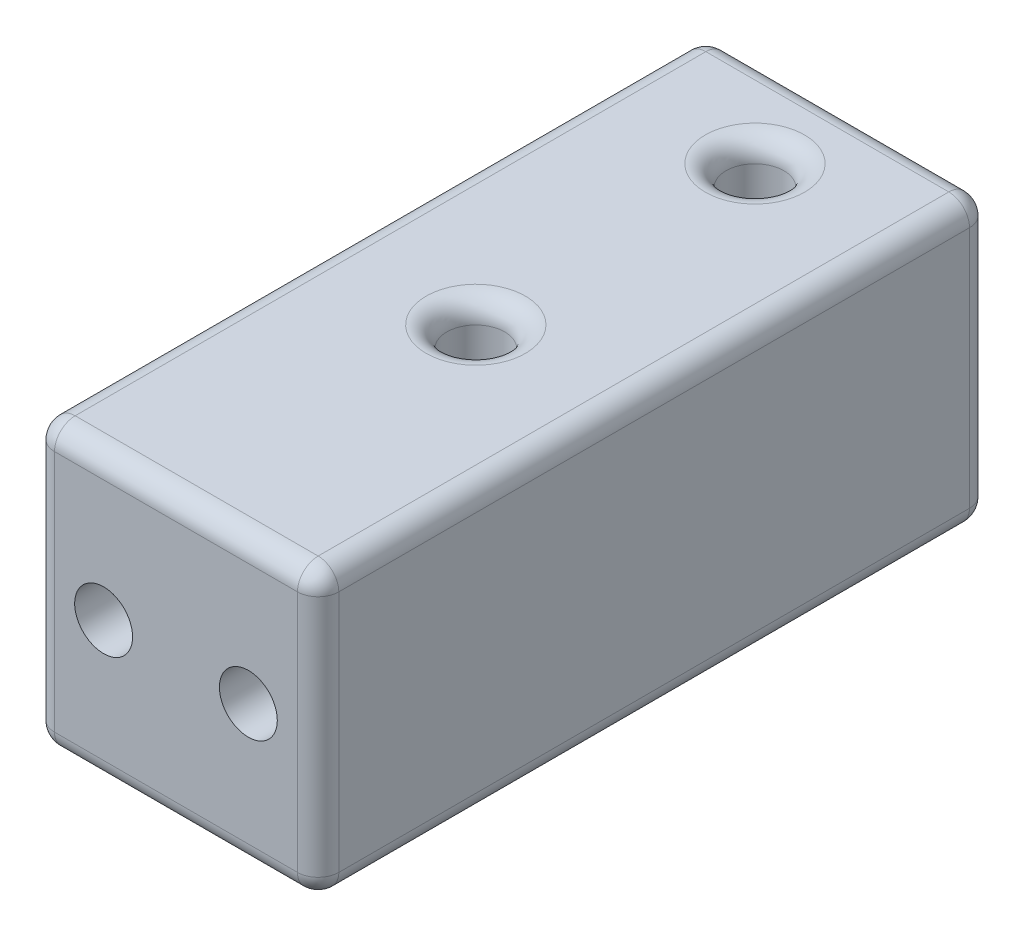
ISO-10303-21;
HEADER;
FILE_DESCRIPTION(('STEP AP214'),'2;1');
FILE_NAME('part.step','',(''),(''),'','','');
FILE_SCHEMA(('AUTOMOTIVE_DESIGN { 1 0 10303 214 1 1 1 1 }'));
ENDSEC;
DATA;
#1=APPLICATION_CONTEXT('core data for automotive mechanical design processes');
#2=APPLICATION_PROTOCOL_DEFINITION('international standard','automotive_design',2000,#1);
#3=PRODUCT_CONTEXT('',#1,'mechanical');
#4=PRODUCT('Part','Part','',(#3));
#5=PRODUCT_RELATED_PRODUCT_CATEGORY('part','',(#4));
#6=PRODUCT_DEFINITION_FORMATION('','',#4);
#7=PRODUCT_DEFINITION_CONTEXT('part definition',#1,'design');
#8=PRODUCT_DEFINITION('design','',#6,#7);
#9=PRODUCT_DEFINITION_SHAPE('','',#8);
#10=(LENGTH_UNIT() NAMED_UNIT(*) SI_UNIT(.MILLI.,.METRE.));
#11=(NAMED_UNIT(*) PLANE_ANGLE_UNIT() SI_UNIT($,.RADIAN.));
#12=(NAMED_UNIT(*) SI_UNIT($,.STERADIAN.) SOLID_ANGLE_UNIT());
#13=UNCERTAINTY_MEASURE_WITH_UNIT(LENGTH_MEASURE(1.E-05),#10,'distance_accuracy_value','');
#14=(GEOMETRIC_REPRESENTATION_CONTEXT(3) GLOBAL_UNCERTAINTY_ASSIGNED_CONTEXT((#13)) GLOBAL_UNIT_ASSIGNED_CONTEXT((#10,
#11,#12)) REPRESENTATION_CONTEXT('',''));
#15=CARTESIAN_POINT('',(0.,0.,0.));
#16=DIRECTION('',(0.,0.,1.));
#17=DIRECTION('',(1.,0.,0.));
#18=AXIS2_PLACEMENT_3D('',#15,#16,#17);
#19=CARTESIAN_POINT('',(6.875,-6.875,-18.));
#20=DIRECTION('',(1.,0.,0.));
#21=DIRECTION('',(0.,0.,-1.));
#22=AXIS2_PLACEMENT_3D('',#19,#20,#21);
#23=PLANE('',#22);
#24=DIRECTION('',(0.,1.,0.));
#25=VECTOR('',#24,1.);
#26=CARTESIAN_POINT('',(6.875,-6.875,13.5));
#27=LINE('',#26,#25);
#28=CARTESIAN_POINT('',(6.875,5.875,13.5));
#29=VERTEX_POINT('',#28);
#30=CARTESIAN_POINT('',(6.875,-5.875,13.5));
#31=VERTEX_POINT('',#30);
#32=EDGE_CURVE('E199',#29,#31,#27,.F.);
#33=ORIENTED_EDGE('',*,*,#32,.T.);
#34=DIRECTION('',(0.,0.,1.));
#35=VECTOR('',#34,1.);
#36=CARTESIAN_POINT('',(6.875,-5.875,-18.));
#37=LINE('',#36,#35);
#38=CARTESIAN_POINT('',(6.875,-5.875,-17.));
#39=VERTEX_POINT('',#38);
#40=EDGE_CURVE('E204',#31,#39,#37,.F.);
#41=ORIENTED_EDGE('',*,*,#40,.T.);
#42=DIRECTION('',(0.,1.,0.));
#43=VECTOR('',#42,1.);
#44=CARTESIAN_POINT('',(6.875,-6.875,-17.));
#45=LINE('',#44,#43);
#46=CARTESIAN_POINT('',(6.875,5.875,-17.));
#47=VERTEX_POINT('',#46);
#48=EDGE_CURVE('E201',#39,#47,#45,.T.);
#49=ORIENTED_EDGE('',*,*,#48,.T.);
#50=DIRECTION('',(0.,0.,1.));
#51=VECTOR('',#50,1.);
#52=CARTESIAN_POINT('',(6.875,5.875,-18.));
#53=LINE('',#52,#51);
#54=EDGE_CURVE('E197',#47,#29,#53,.T.);
#55=ORIENTED_EDGE('',*,*,#54,.T.);
#56=EDGE_LOOP('',(#33,#41,#49,#55));
#57=FACE_BOUND('',#56,.T.);
#58=ADVANCED_FACE('F37',(#57),#23,.T.);
#59=CARTESIAN_POINT('',(-6.875,-6.875,-18.));
#60=DIRECTION('',(0.,-1.,0.));
#61=DIRECTION('',(0.,0.,-1.));
#62=AXIS2_PLACEMENT_3D('',#59,#60,#61);
#63=PLANE('',#62);
#64=CARTESIAN_POINT('',(1.18717353649296E-13,-6.875,-13.5));
#65=DIRECTION('',(0.,-1.,0.));
#66=DIRECTION('',(0.,0.,-1.));
#67=AXIS2_PLACEMENT_3D('',#64,#65,#66);
#68=CIRCLE('',#67,2.4);
#69=CARTESIAN_POINT('',(1.18717353649296E-13,-6.875,-15.9));
#70=VERTEX_POINT('',#69);
#71=EDGE_CURVE('E278',#70,#70,#68,.F.);
#72=ORIENTED_EDGE('',*,*,#71,.T.);
#73=EDGE_LOOP('',(#72));
#74=FACE_BOUND('',#73,.T.);
#75=CARTESIAN_POINT('',(0.,-6.875,0.));
#76=DIRECTION('',(0.,-1.,0.));
#77=DIRECTION('',(0.,0.,-1.));
#78=AXIS2_PLACEMENT_3D('',#75,#76,#77);
#79=CIRCLE('',#78,2.4);
#80=CARTESIAN_POINT('',(0.,-6.875,-2.4));
#81=VERTEX_POINT('',#80);
#82=EDGE_CURVE('E275',#81,#81,#79,.F.);
#83=ORIENTED_EDGE('',*,*,#82,.T.);
#84=EDGE_LOOP('',(#83));
#85=FACE_BOUND('',#84,.T.);
#86=DIRECTION('',(1.,0.,0.));
#87=VECTOR('',#86,1.);
#88=CARTESIAN_POINT('',(-6.875,-6.875,13.5));
#89=LINE('',#88,#87);
#90=CARTESIAN_POINT('',(5.875,-6.875,13.5));
#91=VERTEX_POINT('',#90);
#92=CARTESIAN_POINT('',(-5.875,-6.875,13.5));
#93=VERTEX_POINT('',#92);
#94=EDGE_CURVE('E190',#91,#93,#89,.F.);
#95=ORIENTED_EDGE('',*,*,#94,.T.);
#96=DIRECTION('',(0.,0.,1.));
#97=VECTOR('',#96,1.);
#98=CARTESIAN_POINT('',(-5.875,-6.875,-18.));
#99=LINE('',#98,#97);
#100=CARTESIAN_POINT('',(-5.875,-6.875,-17.));
#101=VERTEX_POINT('',#100);
#102=EDGE_CURVE('E195',#93,#101,#99,.F.);
#103=ORIENTED_EDGE('',*,*,#102,.T.);
#104=DIRECTION('',(1.,0.,0.));
#105=VECTOR('',#104,1.);
#106=CARTESIAN_POINT('',(-6.875,-6.875,-17.));
#107=LINE('',#106,#105);
#108=CARTESIAN_POINT('',(5.875,-6.875,-17.));
#109=VERTEX_POINT('',#108);
#110=EDGE_CURVE('E192',#101,#109,#107,.T.);
#111=ORIENTED_EDGE('',*,*,#110,.T.);
#112=DIRECTION('',(0.,0.,1.));
#113=VECTOR('',#112,1.);
#114=CARTESIAN_POINT('',(5.875,-6.875,-18.));
#115=LINE('',#114,#113);
#116=EDGE_CURVE('E188',#109,#91,#115,.T.);
#117=ORIENTED_EDGE('',*,*,#116,.T.);
#118=EDGE_LOOP('',(#95,#103,#111,#117));
#119=FACE_BOUND('',#118,.T.);
#120=ADVANCED_FACE('F300',(#74,#85,#119),#63,.T.);
#121=CARTESIAN_POINT('',(-6.875,-6.875,-18.));
#122=DIRECTION('',(-1.,0.,0.));
#123=DIRECTION('',(0.,0.,1.));
#124=AXIS2_PLACEMENT_3D('',#121,#122,#123);
#125=PLANE('',#124);
#126=DIRECTION('',(0.,-1.,0.));
#127=VECTOR('',#126,1.);
#128=CARTESIAN_POINT('',(-6.875,-6.875,-17.));
#129=LINE('',#128,#127);
#130=CARTESIAN_POINT('',(-6.875,5.875,-17.));
#131=VERTEX_POINT('',#130);
#132=CARTESIAN_POINT('',(-6.875,-5.875,-17.));
#133=VERTEX_POINT('',#132);
#134=EDGE_CURVE('E183',#131,#133,#129,.T.);
#135=ORIENTED_EDGE('',*,*,#134,.T.);
#136=DIRECTION('',(0.,0.,1.));
#137=VECTOR('',#136,1.);
#138=CARTESIAN_POINT('',(-6.875,-5.875,-18.));
#139=LINE('',#138,#137);
#140=CARTESIAN_POINT('',(-6.875,-5.875,13.5));
#141=VERTEX_POINT('',#140);
#142=EDGE_CURVE('E186',#133,#141,#139,.T.);
#143=ORIENTED_EDGE('',*,*,#142,.T.);
#144=DIRECTION('',(0.,-1.,0.));
#145=VECTOR('',#144,1.);
#146=CARTESIAN_POINT('',(-6.875,6.875,13.5));
#147=LINE('',#146,#145);
#148=CARTESIAN_POINT('',(-6.875,5.875,13.5));
#149=VERTEX_POINT('',#148);
#150=EDGE_CURVE('E181',#141,#149,#147,.F.);
#151=ORIENTED_EDGE('',*,*,#150,.T.);
#152=DIRECTION('',(0.,0.,1.));
#153=VECTOR('',#152,1.);
#154=CARTESIAN_POINT('',(-6.875,5.875,-18.));
#155=LINE('',#154,#153);
#156=EDGE_CURVE('E179',#149,#131,#155,.F.);
#157=ORIENTED_EDGE('',*,*,#156,.T.);
#158=EDGE_LOOP('',(#135,#143,#151,#157));
#159=FACE_BOUND('',#158,.T.);
#160=ADVANCED_FACE('F306',(#159),#125,.T.);
#161=CARTESIAN_POINT('',(-6.875,6.875,-18.));
#162=DIRECTION('',(0.,1.,0.));
#163=DIRECTION('',(0.,0.,1.));
#164=AXIS2_PLACEMENT_3D('',#161,#162,#163);
#165=PLANE('',#164);
#166=CARTESIAN_POINT('',(1.18717353649296E-13,6.875,-13.5));
#167=DIRECTION('',(0.,1.,0.));
#168=DIRECTION('',(0.,0.,1.));
#169=AXIS2_PLACEMENT_3D('',#166,#167,#168);
#170=CIRCLE('',#169,2.4);
#171=CARTESIAN_POINT('',(1.18717353649296E-13,6.875,-11.1));
#172=VERTEX_POINT('',#171);
#173=EDGE_CURVE('E272',#172,#172,#170,.F.);
#174=ORIENTED_EDGE('',*,*,#173,.T.);
#175=EDGE_LOOP('',(#174));
#176=FACE_BOUND('',#175,.T.);
#177=CARTESIAN_POINT('',(0.,6.875,0.));
#178=DIRECTION('',(0.,1.,0.));
#179=DIRECTION('',(0.,0.,1.));
#180=AXIS2_PLACEMENT_3D('',#177,#178,#179);
#181=CIRCLE('',#180,2.4);
#182=CARTESIAN_POINT('',(0.,6.875,2.4));
#183=VERTEX_POINT('',#182);
#184=EDGE_CURVE('E269',#183,#183,#181,.F.);
#185=ORIENTED_EDGE('',*,*,#184,.T.);
#186=EDGE_LOOP('',(#185));
#187=FACE_BOUND('',#186,.T.);
#188=DIRECTION('',(-1.,0.,0.));
#189=VECTOR('',#188,1.);
#190=CARTESIAN_POINT('',(-6.875,6.875,-17.));
#191=LINE('',#190,#189);
#192=CARTESIAN_POINT('',(5.875,6.875,-17.));
#193=VERTEX_POINT('',#192);
#194=CARTESIAN_POINT('',(-5.875,6.875,-17.));
#195=VERTEX_POINT('',#194);
#196=EDGE_CURVE('E136',#193,#195,#191,.T.);
#197=ORIENTED_EDGE('',*,*,#196,.T.);
#198=DIRECTION('',(0.,0.,1.));
#199=VECTOR('',#198,1.);
#200=CARTESIAN_POINT('',(-5.875,6.875,-18.));
#201=LINE('',#200,#199);
#202=CARTESIAN_POINT('',(-5.875,6.875,13.5));
#203=VERTEX_POINT('',#202);
#204=EDGE_CURVE('E132',#195,#203,#201,.T.);
#205=ORIENTED_EDGE('',*,*,#204,.T.);
#206=DIRECTION('',(-1.,0.,0.));
#207=VECTOR('',#206,1.);
#208=CARTESIAN_POINT('',(6.875,6.875,13.5));
#209=LINE('',#208,#207);
#210=CARTESIAN_POINT('',(5.875,6.875,13.5));
#211=VERTEX_POINT('',#210);
#212=EDGE_CURVE('E124',#203,#211,#209,.F.);
#213=ORIENTED_EDGE('',*,*,#212,.T.);
#214=DIRECTION('',(0.,0.,1.));
#215=VECTOR('',#214,1.);
#216=CARTESIAN_POINT('',(5.875,6.875,-18.));
#217=LINE('',#216,#215);
#218=EDGE_CURVE('E129',#211,#193,#217,.F.);
#219=ORIENTED_EDGE('',*,*,#218,.T.);
#220=EDGE_LOOP('',(#197,#205,#213,#219));
#221=FACE_BOUND('',#220,.T.);
#222=ADVANCED_FACE('F127',(#176,#187,#221),#165,.T.);
#223=CARTESIAN_POINT('',(0.,0.,-18.));
#224=DIRECTION('',(0.,0.,-1.));
#225=DIRECTION('',(-1.,0.,0.));
#226=AXIS2_PLACEMENT_3D('',#223,#224,#225);
#227=PLANE('',#226);
#228=CARTESIAN_POINT('',(-3.5,0.,-18.));
#229=DIRECTION('',(0.,0.,1.));
#230=DIRECTION('',(1.,0.,0.));
#231=AXIS2_PLACEMENT_3D('',#228,#229,#230);
#232=CIRCLE('',#231,1.4);
#233=CARTESIAN_POINT('',(-2.1,0.,-18.));
#234=VERTEX_POINT('',#233);
#235=EDGE_CURVE('E216',#234,#234,#232,.T.);
#236=ORIENTED_EDGE('',*,*,#235,.T.);
#237=EDGE_LOOP('',(#236));
#238=FACE_BOUND('',#237,.T.);
#239=CARTESIAN_POINT('',(3.5,0.,-18.));
#240=DIRECTION('',(0.,0.,1.));
#241=DIRECTION('',(1.,0.,0.));
#242=AXIS2_PLACEMENT_3D('',#239,#240,#241);
#243=CIRCLE('',#242,1.4);
#244=CARTESIAN_POINT('',(4.9,0.,-18.));
#245=VERTEX_POINT('',#244);
#246=EDGE_CURVE('E165',#245,#245,#243,.T.);
#247=ORIENTED_EDGE('',*,*,#246,.T.);
#248=EDGE_LOOP('',(#247));
#249=FACE_BOUND('',#248,.T.);
#250=DIRECTION('',(0.,-1.,0.));
#251=VECTOR('',#250,1.);
#252=CARTESIAN_POINT('',(-5.875,0.,-18.));
#253=LINE('',#252,#251);
#254=CARTESIAN_POINT('',(-5.875,-5.875,-18.));
#255=VERTEX_POINT('',#254);
#256=CARTESIAN_POINT('',(-5.875,5.875,-18.));
#257=VERTEX_POINT('',#256);
#258=EDGE_CURVE('E174',#255,#257,#253,.F.);
#259=ORIENTED_EDGE('',*,*,#258,.T.);
#260=DIRECTION('',(-1.,0.,0.));
#261=VECTOR('',#260,1.);
#262=CARTESIAN_POINT('',(0.,5.875,-18.));
#263=LINE('',#262,#261);
#264=CARTESIAN_POINT('',(5.875,5.875,-18.));
#265=VERTEX_POINT('',#264);
#266=EDGE_CURVE('E176',#257,#265,#263,.F.);
#267=ORIENTED_EDGE('',*,*,#266,.T.);
#268=DIRECTION('',(0.,1.,0.));
#269=VECTOR('',#268,1.);
#270=CARTESIAN_POINT('',(5.875,0.,-18.));
#271=LINE('',#270,#269);
#272=CARTESIAN_POINT('',(5.875,-5.875,-18.));
#273=VERTEX_POINT('',#272);
#274=EDGE_CURVE('E170',#265,#273,#271,.F.);
#275=ORIENTED_EDGE('',*,*,#274,.T.);
#276=DIRECTION('',(1.,0.,0.));
#277=VECTOR('',#276,1.);
#278=CARTESIAN_POINT('',(0.,-5.875,-18.));
#279=LINE('',#278,#277);
#280=EDGE_CURVE('E172',#273,#255,#279,.F.);
#281=ORIENTED_EDGE('',*,*,#280,.T.);
#282=EDGE_LOOP('',(#259,#267,#275,#281));
#283=FACE_BOUND('',#282,.T.);
#284=ADVANCED_FACE('F437',(#238,#249,#283),#227,.T.);
#285=CARTESIAN_POINT('',(0.,0.,14.5));
#286=DIRECTION('',(0.,0.,-1.));
#287=DIRECTION('',(-1.,0.,0.));
#288=AXIS2_PLACEMENT_3D('',#285,#286,#287);
#289=PLANE('',#288);
#290=CARTESIAN_POINT('',(-3.5,0.,14.5));
#291=DIRECTION('',(0.,0.,1.));
#292=DIRECTION('',(1.,0.,0.));
#293=AXIS2_PLACEMENT_3D('',#290,#291,#292);
#294=CIRCLE('',#293,1.4);
#295=CARTESIAN_POINT('',(-2.1,0.,14.5));
#296=VERTEX_POINT('',#295);
#297=EDGE_CURVE('E729',#296,#296,#294,.T.);
#298=ORIENTED_EDGE('',*,*,#297,.F.);
#299=EDGE_LOOP('',(#298));
#300=FACE_BOUND('',#299,.T.);
#301=CARTESIAN_POINT('',(3.5,0.,14.5));
#302=DIRECTION('',(0.,0.,1.));
#303=DIRECTION('',(1.,0.,0.));
#304=AXIS2_PLACEMENT_3D('',#301,#302,#303);
#305=CIRCLE('',#304,1.4);
#306=CARTESIAN_POINT('',(4.9,0.,14.5));
#307=VERTEX_POINT('',#306);
#308=EDGE_CURVE('E730',#307,#307,#305,.T.);
#309=ORIENTED_EDGE('',*,*,#308,.F.);
#310=EDGE_LOOP('',(#309));
#311=FACE_BOUND('',#310,.T.);
#312=DIRECTION('',(0.,-1.,0.));
#313=VECTOR('',#312,1.);
#314=CARTESIAN_POINT('',(-5.875,-6.875,14.5));
#315=LINE('',#314,#313);
#316=CARTESIAN_POINT('',(-5.875,5.875,14.5));
#317=VERTEX_POINT('',#316);
#318=CARTESIAN_POINT('',(-5.875,-5.875,14.5));
#319=VERTEX_POINT('',#318);
#320=EDGE_CURVE('E52',#317,#319,#315,.T.);
#321=ORIENTED_EDGE('',*,*,#320,.T.);
#322=DIRECTION('',(1.,0.,0.));
#323=VECTOR('',#322,1.);
#324=CARTESIAN_POINT('',(6.875,-5.875,14.5));
#325=LINE('',#324,#323);
#326=CARTESIAN_POINT('',(5.875,-5.875,14.5));
#327=VERTEX_POINT('',#326);
#328=EDGE_CURVE('E210',#319,#327,#325,.T.);
#329=ORIENTED_EDGE('',*,*,#328,.T.);
#330=DIRECTION('',(0.,1.,0.));
#331=VECTOR('',#330,1.);
#332=CARTESIAN_POINT('',(5.875,6.875,14.5));
#333=LINE('',#332,#331);
#334=CARTESIAN_POINT('',(5.875,5.875,14.5));
#335=VERTEX_POINT('',#334);
#336=EDGE_CURVE('E206',#327,#335,#333,.T.);
#337=ORIENTED_EDGE('',*,*,#336,.T.);
#338=DIRECTION('',(-1.,0.,0.));
#339=VECTOR('',#338,1.);
#340=CARTESIAN_POINT('',(-6.875,5.875,14.5));
#341=LINE('',#340,#339);
#342=EDGE_CURVE('E57',#335,#317,#341,.T.);
#343=ORIENTED_EDGE('',*,*,#342,.T.);
#344=EDGE_LOOP('',(#321,#329,#337,#343));
#345=FACE_BOUND('',#344,.T.);
#346=ADVANCED_FACE('F421',(#300,#311,#345),#289,.F.);
#347=CARTESIAN_POINT('',(1.18717353649296E-13,-6.875,-13.5));
#348=DIRECTION('',(0.,1.,0.));
#349=DIRECTION('',(0.,0.,1.));
#350=AXIS2_PLACEMENT_3D('',#347,#348,#349);
#351=CYLINDRICAL_SURFACE('',#350,1.4);
#352=CARTESIAN_POINT('',(1.18717353649296E-13,5.875,-13.5));
#353=DIRECTION('',(0.,1.,0.));
#354=DIRECTION('',(0.,0.,1.));
#355=AXIS2_PLACEMENT_3D('',#352,#353,#354);
#356=CIRCLE('',#355,1.4);
#357=CARTESIAN_POINT('',(1.18717353649296E-13,5.875,-12.1));
#358=VERTEX_POINT('',#357);
#359=EDGE_CURVE('E266',#358,#358,#356,.T.);
#360=ORIENTED_EDGE('',*,*,#359,.T.);
#361=EDGE_LOOP('',(#360));
#362=FACE_BOUND('',#361,.T.);
#363=CARTESIAN_POINT('',(1.18717353649296E-13,-5.875,-13.5));
#364=DIRECTION('',(0.,-1.,0.));
#365=DIRECTION('',(0.,0.,-1.));
#366=AXIS2_PLACEMENT_3D('',#363,#364,#365);
#367=CIRCLE('',#366,1.4);
#368=CARTESIAN_POINT('',(1.18717353649296E-13,-5.875,-14.9));
#369=VERTEX_POINT('',#368);
#370=EDGE_CURVE('E212',#369,#369,#367,.T.);
#371=ORIENTED_EDGE('',*,*,#370,.T.);
#372=EDGE_LOOP('',(#371));
#373=FACE_BOUND('',#372,.T.);
#374=ADVANCED_FACE('F445',(#362,#373),#351,.F.);
#375=CARTESIAN_POINT('',(0.,-6.875,0.));
#376=DIRECTION('',(0.,1.,0.));
#377=DIRECTION('',(0.,0.,1.));
#378=AXIS2_PLACEMENT_3D('',#375,#376,#377);
#379=CYLINDRICAL_SURFACE('',#378,1.4);
#380=CARTESIAN_POINT('',(0.,-5.875,0.));
#381=DIRECTION('',(0.,-1.,0.));
#382=DIRECTION('',(0.,0.,-1.));
#383=AXIS2_PLACEMENT_3D('',#380,#381,#382);
#384=CIRCLE('',#383,1.4);
#385=CARTESIAN_POINT('',(0.,-5.875,-1.4));
#386=VERTEX_POINT('',#385);
#387=EDGE_CURVE('E11',#386,#386,#384,.T.);
#388=ORIENTED_EDGE('',*,*,#387,.T.);
#389=EDGE_LOOP('',(#388));
#390=FACE_BOUND('',#389,.T.);
#391=CARTESIAN_POINT('',(0.,5.875,0.));
#392=DIRECTION('',(0.,1.,0.));
#393=DIRECTION('',(0.,0.,1.));
#394=AXIS2_PLACEMENT_3D('',#391,#392,#393);
#395=CIRCLE('',#394,1.4);
#396=CARTESIAN_POINT('',(0.,5.875,1.4));
#397=VERTEX_POINT('',#396);
#398=EDGE_CURVE('E45',#397,#397,#395,.T.);
#399=ORIENTED_EDGE('',*,*,#398,.T.);
#400=EDGE_LOOP('',(#399));
#401=FACE_BOUND('',#400,.T.);
#402=ADVANCED_FACE('F283',(#390,#401),#379,.F.);
#403=CARTESIAN_POINT('',(0.,-5.875,13.5));
#404=DIRECTION('',(-1.,0.,0.));
#405=DIRECTION('',(0.,0.,1.));
#406=AXIS2_PLACEMENT_3D('',#403,#404,#405);
#407=CYLINDRICAL_SURFACE('',#406,1.);
#408=CARTESIAN_POINT('',(5.875,-5.875,13.5));
#409=DIRECTION('',(1.,0.,0.));
#410=DIRECTION('',(0.,1.,0.));
#411=AXIS2_PLACEMENT_3D('',#408,#409,#410);
#412=CIRCLE('',#411,1.);
#413=EDGE_CURVE('E159',#327,#91,#412,.T.);
#414=ORIENTED_EDGE('',*,*,#413,.F.);
#415=ORIENTED_EDGE('',*,*,#328,.F.);
#416=CARTESIAN_POINT('',(-5.875,-5.875,13.5));
#417=DIRECTION('',(-1.,0.,0.));
#418=DIRECTION('',(0.,0.,1.));
#419=AXIS2_PLACEMENT_3D('',#416,#417,#418);
#420=CIRCLE('',#419,1.);
#421=EDGE_CURVE('E162',#93,#319,#420,.T.);
#422=ORIENTED_EDGE('',*,*,#421,.F.);
#423=ORIENTED_EDGE('',*,*,#94,.F.);
#424=EDGE_LOOP('',(#414,#415,#422,#423));
#425=FACE_BOUND('',#424,.T.);
#426=ADVANCED_FACE('F382',(#425),#407,.T.);
#427=CARTESIAN_POINT('',(5.875,-5.875,13.5));
#428=DIRECTION('',(0.,-1.,0.));
#429=DIRECTION('',(1.,0.,0.));
#430=AXIS2_PLACEMENT_3D('',#427,#428,#429);
#431=SPHERICAL_SURFACE('',#430,1.);
#432=CARTESIAN_POINT('',(5.875,-5.875,13.5));
#433=DIRECTION('',(0.,-1.,0.));
#434=DIRECTION('',(0.,0.,-1.));
#435=AXIS2_PLACEMENT_3D('',#432,#433,#434);
#436=CIRCLE('',#435,1.);
#437=EDGE_CURVE('E256',#327,#31,#436,.F.);
#438=ORIENTED_EDGE('',*,*,#437,.F.);
#439=ORIENTED_EDGE('',*,*,#413,.T.);
#440=CARTESIAN_POINT('',(5.875,-5.875,13.5));
#441=DIRECTION('',(0.,0.,1.));
#442=DIRECTION('',(1.,0.,0.));
#443=AXIS2_PLACEMENT_3D('',#440,#441,#442);
#444=CIRCLE('',#443,1.);
#445=EDGE_CURVE('E259',#31,#91,#444,.F.);
#446=ORIENTED_EDGE('',*,*,#445,.F.);
#447=EDGE_LOOP('',(#438,#439,#446));
#448=FACE_BOUND('',#447,.T.);
#449=ADVANCED_FACE('F378',(#448),#431,.T.);
#450=CARTESIAN_POINT('',(-5.875,-5.875,13.5));
#451=DIRECTION('',(0.,0.,1.));
#452=DIRECTION('',(1.,0.,0.));
#453=AXIS2_PLACEMENT_3D('',#450,#451,#452);
#454=SPHERICAL_SURFACE('',#453,1.);
#455=CARTESIAN_POINT('',(-5.875,-5.875,13.5));
#456=DIRECTION('',(0.,0.,1.));
#457=DIRECTION('',(1.,0.,0.));
#458=AXIS2_PLACEMENT_3D('',#455,#456,#457);
#459=CIRCLE('',#458,1.);
#460=EDGE_CURVE('E250',#93,#141,#459,.F.);
#461=ORIENTED_EDGE('',*,*,#460,.F.);
#462=ORIENTED_EDGE('',*,*,#421,.T.);
#463=CARTESIAN_POINT('',(-5.875,-5.875,13.5));
#464=DIRECTION('',(0.,-1.,0.));
#465=DIRECTION('',(0.,0.,-1.));
#466=AXIS2_PLACEMENT_3D('',#463,#464,#465);
#467=CIRCLE('',#466,1.);
#468=EDGE_CURVE('E253',#141,#319,#467,.F.);
#469=ORIENTED_EDGE('',*,*,#468,.F.);
#470=EDGE_LOOP('',(#461,#462,#469));
#471=FACE_BOUND('',#470,.T.);
#472=ADVANCED_FACE('F374',(#471),#454,.T.);
#473=CARTESIAN_POINT('',(5.875,-5.875,-18.));
#474=DIRECTION('',(0.,0.,1.));
#475=DIRECTION('',(1.,0.,0.));
#476=AXIS2_PLACEMENT_3D('',#473,#474,#475);
#477=CYLINDRICAL_SURFACE('',#476,1.);
#478=ORIENTED_EDGE('',*,*,#445,.T.);
#479=ORIENTED_EDGE('',*,*,#116,.F.);
#480=CARTESIAN_POINT('',(5.875,-5.875,-17.));
#481=DIRECTION('',(0.,0.,-1.));
#482=DIRECTION('',(-1.,0.,0.));
#483=AXIS2_PLACEMENT_3D('',#480,#481,#482);
#484=CIRCLE('',#483,1.);
#485=EDGE_CURVE('E245',#39,#109,#484,.T.);
#486=ORIENTED_EDGE('',*,*,#485,.F.);
#487=ORIENTED_EDGE('',*,*,#40,.F.);
#488=EDGE_LOOP('',(#478,#479,#486,#487));
#489=FACE_BOUND('',#488,.T.);
#490=ADVANCED_FACE('F370',(#489),#477,.T.);
#491=CARTESIAN_POINT('',(5.875,0.,13.5));
#492=DIRECTION('',(0.,-1.,0.));
#493=DIRECTION('',(0.,0.,-1.));
#494=AXIS2_PLACEMENT_3D('',#491,#492,#493);
#495=CYLINDRICAL_SURFACE('',#494,1.);
#496=ORIENTED_EDGE('',*,*,#437,.T.);
#497=ORIENTED_EDGE('',*,*,#32,.F.);
#498=CARTESIAN_POINT('',(5.875,5.875,13.5));
#499=DIRECTION('',(0.,1.,0.));
#500=DIRECTION('',(0.,0.,1.));
#501=AXIS2_PLACEMENT_3D('',#498,#499,#500);
#502=CIRCLE('',#501,1.);
#503=EDGE_CURVE('E145',#335,#29,#502,.T.);
#504=ORIENTED_EDGE('',*,*,#503,.F.);
#505=ORIENTED_EDGE('',*,*,#336,.F.);
#506=EDGE_LOOP('',(#496,#497,#504,#505));
#507=FACE_BOUND('',#506,.T.);
#508=ADVANCED_FACE('F367',(#507),#495,.T.);
#509=CARTESIAN_POINT('',(0.,5.875,13.5));
#510=DIRECTION('',(1.,0.,0.));
#511=DIRECTION('',(0.,0.,-1.));
#512=AXIS2_PLACEMENT_3D('',#509,#510,#511);
#513=CYLINDRICAL_SURFACE('',#512,1.);
#514=CARTESIAN_POINT('',(-5.875,5.875,13.5));
#515=DIRECTION('',(-1.,0.,0.));
#516=DIRECTION('',(0.,0.,1.));
#517=AXIS2_PLACEMENT_3D('',#514,#515,#516);
#518=CIRCLE('',#517,1.);
#519=EDGE_CURVE('E146',#317,#203,#518,.T.);
#520=ORIENTED_EDGE('',*,*,#519,.F.);
#521=ORIENTED_EDGE('',*,*,#342,.F.);
#522=CARTESIAN_POINT('',(5.875,5.875,13.5));
#523=DIRECTION('',(1.,0.,0.));
#524=DIRECTION('',(0.,0.,-1.));
#525=AXIS2_PLACEMENT_3D('',#522,#523,#524);
#526=CIRCLE('',#525,1.);
#527=EDGE_CURVE('E139',#211,#335,#526,.T.);
#528=ORIENTED_EDGE('',*,*,#527,.F.);
#529=ORIENTED_EDGE('',*,*,#212,.F.);
#530=EDGE_LOOP('',(#520,#521,#528,#529));
#531=FACE_BOUND('',#530,.T.);
#532=ADVANCED_FACE('F141',(#531),#513,.T.);
#533=CARTESIAN_POINT('',(-5.875,0.,13.5));
#534=DIRECTION('',(0.,1.,0.));
#535=DIRECTION('',(0.,0.,1.));
#536=AXIS2_PLACEMENT_3D('',#533,#534,#535);
#537=CYLINDRICAL_SURFACE('',#536,1.);
#538=ORIENTED_EDGE('',*,*,#468,.T.);
#539=ORIENTED_EDGE('',*,*,#320,.F.);
#540=CARTESIAN_POINT('',(-5.875,5.875,13.5));
#541=DIRECTION('',(0.,1.,0.));
#542=DIRECTION('',(0.,0.,1.));
#543=AXIS2_PLACEMENT_3D('',#540,#541,#542);
#544=CIRCLE('',#543,1.);
#545=EDGE_CURVE('E240',#149,#317,#544,.T.);
#546=ORIENTED_EDGE('',*,*,#545,.F.);
#547=ORIENTED_EDGE('',*,*,#150,.F.);
#548=EDGE_LOOP('',(#538,#539,#546,#547));
#549=FACE_BOUND('',#548,.T.);
#550=ADVANCED_FACE('F360',(#549),#537,.T.);
#551=CARTESIAN_POINT('',(-5.875,-5.875,-18.));
#552=DIRECTION('',(0.,0.,1.));
#553=DIRECTION('',(1.,0.,0.));
#554=AXIS2_PLACEMENT_3D('',#551,#552,#553);
#555=CYLINDRICAL_SURFACE('',#554,1.);
#556=ORIENTED_EDGE('',*,*,#460,.T.);
#557=ORIENTED_EDGE('',*,*,#142,.F.);
#558=CARTESIAN_POINT('',(-5.875,-5.875,-17.));
#559=DIRECTION('',(0.,0.,-1.));
#560=DIRECTION('',(-1.,0.,0.));
#561=AXIS2_PLACEMENT_3D('',#558,#559,#560);
#562=CIRCLE('',#561,1.);
#563=EDGE_CURVE('E237',#101,#133,#562,.T.);
#564=ORIENTED_EDGE('',*,*,#563,.F.);
#565=ORIENTED_EDGE('',*,*,#102,.F.);
#566=EDGE_LOOP('',(#556,#557,#564,#565));
#567=FACE_BOUND('',#566,.T.);
#568=ADVANCED_FACE('F356',(#567),#555,.T.);
#569=CARTESIAN_POINT('',(-6.875,-5.875,-17.));
#570=DIRECTION('',(1.,0.,0.));
#571=DIRECTION('',(0.,0.,-1.));
#572=AXIS2_PLACEMENT_3D('',#569,#570,#571);
#573=CYLINDRICAL_SURFACE('',#572,1.);
#574=CARTESIAN_POINT('',(5.875,-5.875,-17.));
#575=DIRECTION('',(1.,0.,0.));
#576=DIRECTION('',(0.,0.,-1.));
#577=AXIS2_PLACEMENT_3D('',#574,#575,#576);
#578=CIRCLE('',#577,1.);
#579=EDGE_CURVE('E247',#109,#273,#578,.T.);
#580=ORIENTED_EDGE('',*,*,#579,.F.);
#581=ORIENTED_EDGE('',*,*,#110,.F.);
#582=CARTESIAN_POINT('',(-5.875,-5.875,-17.));
#583=DIRECTION('',(-1.,0.,0.));
#584=DIRECTION('',(0.,0.,1.));
#585=AXIS2_PLACEMENT_3D('',#582,#583,#584);
#586=CIRCLE('',#585,1.);
#587=EDGE_CURVE('E234',#255,#101,#586,.T.);
#588=ORIENTED_EDGE('',*,*,#587,.F.);
#589=ORIENTED_EDGE('',*,*,#280,.F.);
#590=EDGE_LOOP('',(#580,#581,#588,#589));
#591=FACE_BOUND('',#590,.T.);
#592=ADVANCED_FACE('F352',(#591),#573,.T.);
#593=CARTESIAN_POINT('',(5.875,-5.875,-17.));
#594=DIRECTION('',(0.,-1.,0.));
#595=DIRECTION('',(1.,0.,0.));
#596=AXIS2_PLACEMENT_3D('',#593,#594,#595);
#597=SPHERICAL_SURFACE('',#596,1.);
#598=ORIENTED_EDGE('',*,*,#485,.T.);
#599=ORIENTED_EDGE('',*,*,#579,.T.);
#600=CARTESIAN_POINT('',(5.875,-5.875,-17.));
#601=DIRECTION('',(0.,-1.,0.));
#602=DIRECTION('',(0.,0.,-1.));
#603=AXIS2_PLACEMENT_3D('',#600,#601,#602);
#604=CIRCLE('',#603,1.);
#605=EDGE_CURVE('E153',#39,#273,#604,.F.);
#606=ORIENTED_EDGE('',*,*,#605,.F.);
#607=EDGE_LOOP('',(#598,#599,#606));
#608=FACE_BOUND('',#607,.T.);
#609=ADVANCED_FACE('F349',(#608),#597,.T.);
#610=CARTESIAN_POINT('',(5.875,5.875,13.5));
#611=DIRECTION('',(0.,0.,1.));
#612=DIRECTION('',(1.,0.,0.));
#613=AXIS2_PLACEMENT_3D('',#610,#611,#612);
#614=SPHERICAL_SURFACE('',#613,1.);
#615=ORIENTED_EDGE('',*,*,#527,.T.);
#616=ORIENTED_EDGE('',*,*,#503,.T.);
#617=CARTESIAN_POINT('',(5.875,5.875,13.5));
#618=DIRECTION('',(0.,0.,1.));
#619=DIRECTION('',(1.,0.,0.));
#620=AXIS2_PLACEMENT_3D('',#617,#618,#619);
#621=CIRCLE('',#620,1.);
#622=EDGE_CURVE('E149',#211,#29,#621,.F.);
#623=ORIENTED_EDGE('',*,*,#622,.F.);
#624=EDGE_LOOP('',(#615,#616,#623));
#625=FACE_BOUND('',#624,.T.);
#626=ADVANCED_FACE('F150',(#625),#614,.T.);
#627=CARTESIAN_POINT('',(-5.875,5.875,13.5));
#628=DIRECTION('',(0.,0.,1.));
#629=DIRECTION('',(1.,0.,0.));
#630=AXIS2_PLACEMENT_3D('',#627,#628,#629);
#631=SPHERICAL_SURFACE('',#630,1.);
#632=ORIENTED_EDGE('',*,*,#545,.T.);
#633=ORIENTED_EDGE('',*,*,#519,.T.);
#634=CARTESIAN_POINT('',(-5.875,5.875,13.5));
#635=DIRECTION('',(0.,0.,1.));
#636=DIRECTION('',(1.,0.,0.));
#637=AXIS2_PLACEMENT_3D('',#634,#635,#636);
#638=CIRCLE('',#637,1.);
#639=EDGE_CURVE('E154',#149,#203,#638,.F.);
#640=ORIENTED_EDGE('',*,*,#639,.F.);
#641=EDGE_LOOP('',(#632,#633,#640));
#642=FACE_BOUND('',#641,.T.);
#643=ADVANCED_FACE('F342',(#642),#631,.T.);
#644=CARTESIAN_POINT('',(-5.875,-5.875,-17.));
#645=DIRECTION('',(0.,-1.,0.));
#646=DIRECTION('',(0.,0.,-1.));
#647=AXIS2_PLACEMENT_3D('',#644,#645,#646);
#648=SPHERICAL_SURFACE('',#647,1.);
#649=ORIENTED_EDGE('',*,*,#587,.T.);
#650=ORIENTED_EDGE('',*,*,#563,.T.);
#651=CARTESIAN_POINT('',(-5.875,-5.875,-17.));
#652=DIRECTION('',(0.,-1.,0.));
#653=DIRECTION('',(0.,0.,-1.));
#654=AXIS2_PLACEMENT_3D('',#651,#652,#653);
#655=CIRCLE('',#654,1.);
#656=EDGE_CURVE('E228',#255,#133,#655,.F.);
#657=ORIENTED_EDGE('',*,*,#656,.F.);
#658=EDGE_LOOP('',(#649,#650,#657));
#659=FACE_BOUND('',#658,.T.);
#660=ADVANCED_FACE('F338',(#659),#648,.T.);
#661=CARTESIAN_POINT('',(5.875,-6.875,-17.));
#662=DIRECTION('',(0.,1.,0.));
#663=DIRECTION('',(0.,0.,1.));
#664=AXIS2_PLACEMENT_3D('',#661,#662,#663);
#665=CYLINDRICAL_SURFACE('',#664,1.);
#666=ORIENTED_EDGE('',*,*,#605,.T.);
#667=ORIENTED_EDGE('',*,*,#274,.F.);
#668=CARTESIAN_POINT('',(5.875,5.875,-17.));
#669=DIRECTION('',(0.,1.,0.));
#670=DIRECTION('',(0.,0.,1.));
#671=AXIS2_PLACEMENT_3D('',#668,#669,#670);
#672=CIRCLE('',#671,1.);
#673=EDGE_CURVE('E225',#47,#265,#672,.T.);
#674=ORIENTED_EDGE('',*,*,#673,.F.);
#675=ORIENTED_EDGE('',*,*,#48,.F.);
#676=EDGE_LOOP('',(#666,#667,#674,#675));
#677=FACE_BOUND('',#676,.T.);
#678=ADVANCED_FACE('F335',(#677),#665,.T.);
#679=CARTESIAN_POINT('',(5.875,5.875,-18.));
#680=DIRECTION('',(0.,0.,1.));
#681=DIRECTION('',(1.,0.,0.));
#682=AXIS2_PLACEMENT_3D('',#679,#680,#681);
#683=CYLINDRICAL_SURFACE('',#682,1.);
#684=ORIENTED_EDGE('',*,*,#622,.T.);
#685=ORIENTED_EDGE('',*,*,#54,.F.);
#686=CARTESIAN_POINT('',(5.875,5.875,-17.));
#687=DIRECTION('',(0.,0.,-1.));
#688=DIRECTION('',(-1.,0.,0.));
#689=AXIS2_PLACEMENT_3D('',#686,#687,#688);
#690=CIRCLE('',#689,1.);
#691=EDGE_CURVE('E157',#193,#47,#690,.T.);
#692=ORIENTED_EDGE('',*,*,#691,.F.);
#693=ORIENTED_EDGE('',*,*,#218,.F.);
#694=EDGE_LOOP('',(#684,#685,#692,#693));
#695=FACE_BOUND('',#694,.T.);
#696=ADVANCED_FACE('F156',(#695),#683,.T.);
#697=CARTESIAN_POINT('',(-5.875,5.875,-18.));
#698=DIRECTION('',(0.,0.,1.));
#699=DIRECTION('',(1.,0.,0.));
#700=AXIS2_PLACEMENT_3D('',#697,#698,#699);
#701=CYLINDRICAL_SURFACE('',#700,1.);
#702=ORIENTED_EDGE('',*,*,#639,.T.);
#703=ORIENTED_EDGE('',*,*,#204,.F.);
#704=CARTESIAN_POINT('',(-5.875,5.875,-17.));
#705=DIRECTION('',(0.,0.,-1.));
#706=DIRECTION('',(-1.,0.,0.));
#707=AXIS2_PLACEMENT_3D('',#704,#705,#706);
#708=CIRCLE('',#707,1.);
#709=EDGE_CURVE('E221',#131,#195,#708,.T.);
#710=ORIENTED_EDGE('',*,*,#709,.F.);
#711=ORIENTED_EDGE('',*,*,#156,.F.);
#712=EDGE_LOOP('',(#702,#703,#710,#711));
#713=FACE_BOUND('',#712,.T.);
#714=ADVANCED_FACE('F328',(#713),#701,.T.);
#715=CARTESIAN_POINT('',(-5.875,-6.875,-17.));
#716=DIRECTION('',(0.,-1.,0.));
#717=DIRECTION('',(0.,0.,-1.));
#718=AXIS2_PLACEMENT_3D('',#715,#716,#717);
#719=CYLINDRICAL_SURFACE('',#718,1.);
#720=ORIENTED_EDGE('',*,*,#656,.T.);
#721=ORIENTED_EDGE('',*,*,#134,.F.);
#722=CARTESIAN_POINT('',(-5.875,5.875,-17.));
#723=DIRECTION('',(0.,1.,0.));
#724=DIRECTION('',(0.,0.,1.));
#725=AXIS2_PLACEMENT_3D('',#722,#723,#724);
#726=CIRCLE('',#725,1.);
#727=EDGE_CURVE('E218',#257,#131,#726,.T.);
#728=ORIENTED_EDGE('',*,*,#727,.F.);
#729=ORIENTED_EDGE('',*,*,#258,.F.);
#730=EDGE_LOOP('',(#720,#721,#728,#729));
#731=FACE_BOUND('',#730,.T.);
#732=ADVANCED_FACE('F324',(#731),#719,.T.);
#733=CARTESIAN_POINT('',(5.875,5.875,-17.));
#734=DIRECTION('',(1.,0.,0.));
#735=DIRECTION('',(0.,0.,-1.));
#736=AXIS2_PLACEMENT_3D('',#733,#734,#735);
#737=SPHERICAL_SURFACE('',#736,1.);
#738=ORIENTED_EDGE('',*,*,#691,.T.);
#739=ORIENTED_EDGE('',*,*,#673,.T.);
#740=CARTESIAN_POINT('',(5.875,5.875,-17.));
#741=DIRECTION('',(1.,0.,0.));
#742=DIRECTION('',(0.,0.,-1.));
#743=AXIS2_PLACEMENT_3D('',#740,#741,#742);
#744=CIRCLE('',#743,1.);
#745=EDGE_CURVE('E215',#193,#265,#744,.F.);
#746=ORIENTED_EDGE('',*,*,#745,.F.);
#747=EDGE_LOOP('',(#738,#739,#746));
#748=FACE_BOUND('',#747,.T.);
#749=ADVANCED_FACE('F320',(#748),#737,.T.);
#750=CARTESIAN_POINT('',(-5.875,5.875,-17.));
#751=DIRECTION('',(-1.,0.,0.));
#752=DIRECTION('',(0.,0.,1.));
#753=AXIS2_PLACEMENT_3D('',#750,#751,#752);
#754=SPHERICAL_SURFACE('',#753,1.);
#755=ORIENTED_EDGE('',*,*,#727,.T.);
#756=ORIENTED_EDGE('',*,*,#709,.T.);
#757=CARTESIAN_POINT('',(-5.875,5.875,-17.));
#758=DIRECTION('',(-1.,0.,0.));
#759=DIRECTION('',(0.,0.,1.));
#760=AXIS2_PLACEMENT_3D('',#757,#758,#759);
#761=CIRCLE('',#760,1.);
#762=EDGE_CURVE('E213',#257,#195,#761,.F.);
#763=ORIENTED_EDGE('',*,*,#762,.F.);
#764=EDGE_LOOP('',(#755,#756,#763));
#765=FACE_BOUND('',#764,.T.);
#766=ADVANCED_FACE('F316',(#765),#754,.T.);
#767=CARTESIAN_POINT('',(-6.875,5.875,-17.));
#768=DIRECTION('',(-1.,0.,0.));
#769=DIRECTION('',(0.,0.,1.));
#770=AXIS2_PLACEMENT_3D('',#767,#768,#769);
#771=CYLINDRICAL_SURFACE('',#770,1.);
#772=ORIENTED_EDGE('',*,*,#745,.T.);
#773=ORIENTED_EDGE('',*,*,#266,.F.);
#774=ORIENTED_EDGE('',*,*,#762,.T.);
#775=ORIENTED_EDGE('',*,*,#196,.F.);
#776=EDGE_LOOP('',(#772,#773,#774,#775));
#777=FACE_BOUND('',#776,.T.);
#778=ADVANCED_FACE('F312',(#777),#771,.T.);
#779=CARTESIAN_POINT('',(1.18717353649296E-13,5.875,-13.5));
#780=DIRECTION('',(0.,1.,0.));
#781=DIRECTION('',(0.,0.,1.));
#782=AXIS2_PLACEMENT_3D('',#779,#780,#781);
#783=TOROIDAL_SURFACE('',#782,2.4,1.);
#784=ORIENTED_EDGE('',*,*,#173,.F.);
#785=EDGE_LOOP('',(#784));
#786=FACE_BOUND('',#785,.T.);
#787=ORIENTED_EDGE('',*,*,#359,.F.);
#788=EDGE_LOOP('',(#787));
#789=FACE_BOUND('',#788,.T.);
#790=ADVANCED_FACE('F315',(#786,#789),#783,.T.);
#791=CARTESIAN_POINT('',(1.18717353649296E-13,-5.875,-13.5));
#792=DIRECTION('',(0.,-1.,0.));
#793=DIRECTION('',(0.,0.,-1.));
#794=AXIS2_PLACEMENT_3D('',#791,#792,#793);
#795=TOROIDAL_SURFACE('',#794,2.4,1.);
#796=ORIENTED_EDGE('',*,*,#370,.F.);
#797=EDGE_LOOP('',(#796));
#798=FACE_BOUND('',#797,.T.);
#799=ORIENTED_EDGE('',*,*,#71,.F.);
#800=EDGE_LOOP('',(#799));
#801=FACE_BOUND('',#800,.T.);
#802=ADVANCED_FACE('F296',(#798,#801),#795,.T.);
#803=CARTESIAN_POINT('',(0.,-5.875,0.));
#804=DIRECTION('',(0.,-1.,0.));
#805=DIRECTION('',(0.,0.,-1.));
#806=AXIS2_PLACEMENT_3D('',#803,#804,#805);
#807=TOROIDAL_SURFACE('',#806,2.4,1.);
#808=ORIENTED_EDGE('',*,*,#387,.F.);
#809=EDGE_LOOP('',(#808));
#810=FACE_BOUND('',#809,.T.);
#811=ORIENTED_EDGE('',*,*,#82,.F.);
#812=EDGE_LOOP('',(#811));
#813=FACE_BOUND('',#812,.T.);
#814=ADVANCED_FACE('F287',(#810,#813),#807,.T.);
#815=CARTESIAN_POINT('',(0.,5.875,0.));
#816=DIRECTION('',(0.,1.,0.));
#817=DIRECTION('',(0.,0.,1.));
#818=AXIS2_PLACEMENT_3D('',#815,#816,#817);
#819=TOROIDAL_SURFACE('',#818,2.4,1.);
#820=ORIENTED_EDGE('',*,*,#184,.F.);
#821=EDGE_LOOP('',(#820));
#822=FACE_BOUND('',#821,.T.);
#823=ORIENTED_EDGE('',*,*,#398,.F.);
#824=EDGE_LOOP('',(#823));
#825=FACE_BOUND('',#824,.T.);
#826=ADVANCED_FACE('F39',(#822,#825),#819,.T.);
#827=CARTESIAN_POINT('',(3.5,0.,-18.));
#828=DIRECTION('',(0.,0.,1.));
#829=DIRECTION('',(1.,0.,0.));
#830=AXIS2_PLACEMENT_3D('',#827,#828,#829);
#831=CYLINDRICAL_SURFACE('',#830,1.4);
#832=ORIENTED_EDGE('',*,*,#246,.F.);
#833=EDGE_LOOP('',(#832));
#834=FACE_BOUND('',#833,.T.);
#835=ORIENTED_EDGE('',*,*,#308,.T.);
#836=EDGE_LOOP('',(#835));
#837=FACE_BOUND('',#836,.T.);
#838=ADVANCED_FACE('F286',(#834,#837),#831,.F.);
#839=CARTESIAN_POINT('',(-3.5,0.,-18.));
#840=DIRECTION('',(0.,0.,1.));
#841=DIRECTION('',(1.,0.,0.));
#842=AXIS2_PLACEMENT_3D('',#839,#840,#841);
#843=CYLINDRICAL_SURFACE('',#842,1.4);
#844=ORIENTED_EDGE('',*,*,#235,.F.);
#845=EDGE_LOOP('',(#844));
#846=FACE_BOUND('',#845,.T.);
#847=ORIENTED_EDGE('',*,*,#297,.T.);
#848=EDGE_LOOP('',(#847));
#849=FACE_BOUND('',#848,.T.);
#850=ADVANCED_FACE('F293',(#846,#849),#843,.F.);
#851=CLOSED_SHELL('',(#58,#120,#160,#222,#284,#346,#374,#402,#426,#449,#472,#490,#508,#532,#550,
#568,#592,#609,#626,#643,#660,#678,#696,#714,#732,#749,#766,#778,#790,#802,#814,#826,#838,#850));
#852=MANIFOLD_SOLID_BREP('B2',#851);
#853=ADVANCED_BREP_SHAPE_REPRESENTATION('',(#18,#852),#14);
#854=SHAPE_DEFINITION_REPRESENTATION(#9,#853);
ENDSEC;
END-ISO-10303-21;
